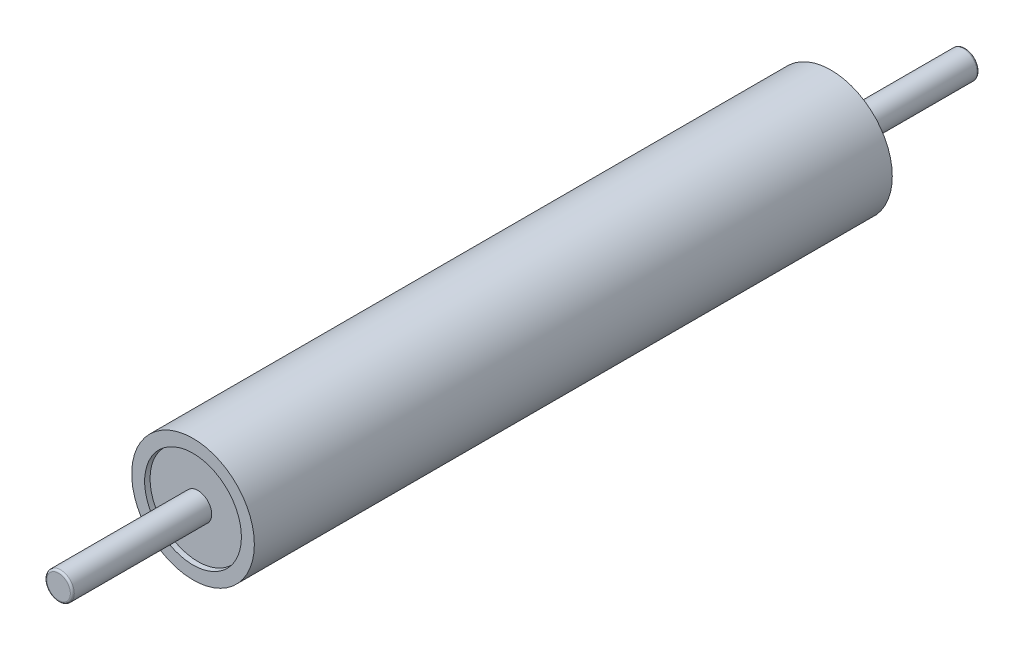
ISO-10303-21;
HEADER;
FILE_DESCRIPTION(('STEP AP214'),'2;1');
FILE_NAME('part.step','',(''),(''),'','','');
FILE_SCHEMA(('AUTOMOTIVE_DESIGN { 1 0 10303 214 1 1 1 1 }'));
ENDSEC;
DATA;
#1=APPLICATION_CONTEXT('core data for automotive mechanical design processes');
#2=APPLICATION_PROTOCOL_DEFINITION('international standard','automotive_design',2000,#1);
#3=PRODUCT_CONTEXT('',#1,'mechanical');
#4=PRODUCT('Part','Part','',(#3));
#5=PRODUCT_RELATED_PRODUCT_CATEGORY('part','',(#4));
#6=PRODUCT_DEFINITION_FORMATION('','',#4);
#7=PRODUCT_DEFINITION_CONTEXT('part definition',#1,'design');
#8=PRODUCT_DEFINITION('design','',#6,#7);
#9=PRODUCT_DEFINITION_SHAPE('','',#8);
#10=(LENGTH_UNIT() NAMED_UNIT(*) SI_UNIT(.MILLI.,.METRE.));
#11=(NAMED_UNIT(*) PLANE_ANGLE_UNIT() SI_UNIT($,.RADIAN.));
#12=(NAMED_UNIT(*) SI_UNIT($,.STERADIAN.) SOLID_ANGLE_UNIT());
#13=UNCERTAINTY_MEASURE_WITH_UNIT(LENGTH_MEASURE(1.E-05),#10,'distance_accuracy_value','');
#14=(GEOMETRIC_REPRESENTATION_CONTEXT(3) GLOBAL_UNCERTAINTY_ASSIGNED_CONTEXT((#13)) GLOBAL_UNIT_ASSIGNED_CONTEXT((#10,
#11,#12)) REPRESENTATION_CONTEXT('',''));
#15=CARTESIAN_POINT('',(0.,0.,0.));
#16=DIRECTION('',(0.,0.,1.));
#17=DIRECTION('',(1.,0.,0.));
#18=AXIS2_PLACEMENT_3D('',#15,#16,#17);
#19=CARTESIAN_POINT('',(169.486096031671,197.021568845784,629.124078995286));
#20=DIRECTION('',(0.,0.,-1.));
#21=DIRECTION('',(-0.982062299122621,0.188556730566668,0.));
#22=AXIS2_PLACEMENT_3D('',#19,#20,#21);
#23=CYLINDRICAL_SURFACE('',#22,48.8);
#24=CARTESIAN_POINT('',(169.486096031671,197.021568845784,629.124078995286));
#25=DIRECTION('',(0.,0.,1.));
#26=DIRECTION('',(0.982062299122621,-0.188556730566668,0.));
#27=AXIS2_PLACEMENT_3D('',#24,#25,#26);
#28=CIRCLE('',#27,48.8);
#29=CARTESIAN_POINT('',(217.410736228855,187.820000394131,629.124078995286));
#30=VERTEX_POINT('',#29);
#31=EDGE_CURVE('P0_E10',#30,#30,#28,.T.);
#32=ORIENTED_EDGE('',*,*,#31,.F.);
#33=EDGE_LOOP('',(#32));
#34=FACE_BOUND('',#33,.T.);
#35=CARTESIAN_POINT('',(169.486096031671,197.021568845784,622.124078995286));
#36=DIRECTION('',(0.,0.,1.));
#37=DIRECTION('',(0.982062299122621,-0.188556730566668,0.));
#38=AXIS2_PLACEMENT_3D('',#35,#36,#37);
#39=CIRCLE('',#38,48.8);
#40=CARTESIAN_POINT('',(217.410736228855,187.820000394131,622.124078995286));
#41=VERTEX_POINT('',#40);
#42=EDGE_CURVE('P0_E18',#41,#41,#39,.T.);
#43=ORIENTED_EDGE('',*,*,#42,.T.);
#44=EDGE_LOOP('',(#43));
#45=FACE_BOUND('',#44,.T.);
#46=ADVANCED_FACE('P0_F15',(#34,#45),#23,.T.);
#47=CARTESIAN_POINT('',(169.486096031671,197.021568845784,629.124078995286));
#48=DIRECTION('',(0.,0.,1.));
#49=DIRECTION('',(0.982062299122621,-0.188556730566668,0.));
#50=AXIS2_PLACEMENT_3D('',#47,#48,#49);
#51=PLANE('',#50);
#52=ORIENTED_EDGE('',*,*,#31,.T.);
#53=EDGE_LOOP('',(#52));
#54=FACE_BOUND('',#53,.T.);
#55=ADVANCED_FACE('P0_F30',(#54),#51,.T.);
#56=CARTESIAN_POINT('',(169.486096031671,197.021568845784,622.124078995286));
#57=DIRECTION('',(0.,0.,1.));
#58=DIRECTION('',(0.982062299122621,-0.188556730566668,0.));
#59=AXIS2_PLACEMENT_3D('',#56,#57,#58);
#60=PLANE('',#59);
#61=ORIENTED_EDGE('',*,*,#42,.F.);
#62=EDGE_LOOP('',(#61));
#63=FACE_BOUND('',#62,.T.);
#64=ADVANCED_FACE('P0_F28',(#63),#60,.F.);
#65=CLOSED_SHELL('',(#46,#55,#64));
#66=MANIFOLD_SOLID_BREP('P0_B1',#65);
#67=CARTESIAN_POINT('',(169.486096031671,197.021568845784,763.775851854555));
#68=DIRECTION('',(0.,0.,1.));
#69=DIRECTION('',(1.,0.,0.));
#70=AXIS2_PLACEMENT_3D('',#67,#68,#69);
#71=CYLINDRICAL_SURFACE('',#70,62.5);
#72=CARTESIAN_POINT('',(169.486096031671,197.021568845784,634.124078995286));
#73=DIRECTION('',(0.,0.,1.));
#74=DIRECTION('',(1.,0.,0.));
#75=AXIS2_PLACEMENT_3D('',#72,#73,#74);
#76=CIRCLE('',#75,62.5);
#77=CARTESIAN_POINT('',(231.986096031671,197.021568845784,634.124078995286));
#78=VERTEX_POINT('',#77);
#79=EDGE_CURVE('P1_E29',#78,#78,#76,.T.);
#80=ORIENTED_EDGE('',*,*,#79,.F.);
#81=EDGE_LOOP('',(#80));
#82=FACE_BOUND('',#81,.T.);
#83=CARTESIAN_POINT('',(169.486096031671,197.021568845784,-15.875921004714));
#84=DIRECTION('',(0.,0.,1.));
#85=DIRECTION('',(1.,0.,0.));
#86=AXIS2_PLACEMENT_3D('',#83,#84,#85);
#87=CIRCLE('',#86,62.5);
#88=CARTESIAN_POINT('',(231.986096031671,197.021568845784,-15.875921004714));
#89=VERTEX_POINT('',#88);
#90=EDGE_CURVE('P1_E10',#89,#89,#87,.T.);
#91=ORIENTED_EDGE('',*,*,#90,.T.);
#92=EDGE_LOOP('',(#91));
#93=FACE_BOUND('',#92,.T.);
#94=ADVANCED_FACE('P1_F15',(#82,#93),#71,.T.);
#95=CARTESIAN_POINT('',(169.486096031671,259.521568845784,-15.875921004714));
#96=DIRECTION('',(0.,0.,1.));
#97=DIRECTION('',(1.,0.,0.));
#98=AXIS2_PLACEMENT_3D('',#95,#96,#97);
#99=PLANE('',#98);
#100=ORIENTED_EDGE('',*,*,#90,.F.);
#101=EDGE_LOOP('',(#100));
#102=FACE_BOUND('',#101,.T.);
#103=CARTESIAN_POINT('',(169.486096031671,197.021568845784,-15.875921004714));
#104=DIRECTION('',(0.,0.,1.));
#105=DIRECTION('',(1.,0.,0.));
#106=AXIS2_PLACEMENT_3D('',#103,#104,#105);
#107=CIRCLE('',#106,49.3000000000001);
#108=CARTESIAN_POINT('',(218.786096031671,197.021568845784,-15.875921004714));
#109=VERTEX_POINT('',#108);
#110=EDGE_CURVE('P1_E21',#109,#109,#107,.T.);
#111=ORIENTED_EDGE('',*,*,#110,.T.);
#112=EDGE_LOOP('',(#111));
#113=FACE_BOUND('',#112,.T.);
#114=ADVANCED_FACE('P1_F38',(#102,#113),#99,.F.);
#115=CARTESIAN_POINT('',(169.486096031671,197.021568845784,763.775851854555));
#116=DIRECTION('',(0.,0.,1.));
#117=DIRECTION('',(1.,0.,0.));
#118=AXIS2_PLACEMENT_3D('',#115,#116,#117);
#119=CYLINDRICAL_SURFACE('',#118,49.3);
#120=ORIENTED_EDGE('',*,*,#110,.F.);
#121=EDGE_LOOP('',(#120));
#122=FACE_BOUND('',#121,.T.);
#123=CARTESIAN_POINT('',(169.486096031671,197.021568845784,634.124078995286));
#124=DIRECTION('',(0.,0.,1.));
#125=DIRECTION('',(1.,0.,0.));
#126=AXIS2_PLACEMENT_3D('',#123,#124,#125);
#127=CIRCLE('',#126,49.3);
#128=CARTESIAN_POINT('',(218.786096031671,197.021568845784,634.124078995286));
#129=VERTEX_POINT('',#128);
#130=EDGE_CURVE('P1_E25',#129,#129,#127,.T.);
#131=ORIENTED_EDGE('',*,*,#130,.T.);
#132=EDGE_LOOP('',(#131));
#133=FACE_BOUND('',#132,.T.);
#134=ADVANCED_FACE('P1_F43',(#122,#133),#119,.F.);
#135=CARTESIAN_POINT('',(169.486096031671,246.321568845784,634.124078995286));
#136=DIRECTION('',(0.,0.,-1.));
#137=DIRECTION('',(-1.,0.,0.));
#138=AXIS2_PLACEMENT_3D('',#135,#136,#137);
#139=PLANE('',#138);
#140=ORIENTED_EDGE('',*,*,#130,.F.);
#141=EDGE_LOOP('',(#140));
#142=FACE_BOUND('',#141,.T.);
#143=ORIENTED_EDGE('',*,*,#79,.T.);
#144=EDGE_LOOP('',(#143));
#145=FACE_BOUND('',#144,.T.);
#146=ADVANCED_FACE('P1_F35',(#142,#145),#139,.F.);
#147=CLOSED_SHELL('',(#94,#114,#134,#146));
#148=MANIFOLD_SOLID_BREP('P1_B1',#147);
#149=CARTESIAN_POINT('',(169.486096031671,197.021568845784,-3.87592100471402));
#150=DIRECTION('',(0.,0.,-1.));
#151=DIRECTION('',(-0.965867779274395,-0.259035582419769,0.));
#152=AXIS2_PLACEMENT_3D('',#149,#150,#151);
#153=CYLINDRICAL_SURFACE('',#152,48.8);
#154=CARTESIAN_POINT('',(169.486096031671,197.021568845784,-3.87592100471402));
#155=DIRECTION('',(0.,0.,1.));
#156=DIRECTION('',(0.965867779274395,0.259035582419769,0.));
#157=AXIS2_PLACEMENT_3D('',#154,#155,#156);
#158=CIRCLE('',#157,48.8);
#159=CARTESIAN_POINT('',(122.351748403081,184.3806324237,-3.87592100471402));
#160=VERTEX_POINT('',#159);
#161=EDGE_CURVE('P2_E10',#160,#160,#158,.T.);
#162=CARTESIAN_POINT('',(169.486096031671,197.021568845784,-10.875921004714));
#163=DIRECTION('',(0.,0.,1.));
#164=DIRECTION('',(0.965867779274395,0.259035582419769,0.));
#165=AXIS2_PLACEMENT_3D('',#162,#163,#164);
#166=CIRCLE('',#165,48.8);
#167=CARTESIAN_POINT('',(122.351748403081,184.3806324237,-10.875921004714));
#168=VERTEX_POINT('',#167);
#169=EDGE_CURVE('P2_E18',#168,#168,#166,.T.);
#170=CARTESIAN_POINT('',(122.351748403081,184.3806324237,-3.87592100471402));
#171=CARTESIAN_POINT('',(122.351748403081,184.3806324237,-3.94883767138069));
#172=CARTESIAN_POINT('',(122.351748403081,184.3806324237,-4.02175433804736));
#173=CARTESIAN_POINT('',(122.351748403081,184.3806324237,-4.16758767138069));
#174=CARTESIAN_POINT('',(122.351748403081,184.3806324237,-4.24050433804736));
#175=CARTESIAN_POINT('',(122.351748403081,184.3806324237,-4.38633767138069));
#176=CARTESIAN_POINT('',(122.351748403081,184.3806324237,-4.45925433804736));
#177=CARTESIAN_POINT('',(122.351748403081,184.3806324237,-4.60508767138069));
#178=CARTESIAN_POINT('',(122.351748403081,184.3806324237,-4.67800433804736));
#179=CARTESIAN_POINT('',(122.351748403081,184.3806324237,-4.82383767138069));
#180=CARTESIAN_POINT('',(122.351748403081,184.3806324237,-4.89675433804736));
#181=CARTESIAN_POINT('',(122.351748403081,184.3806324237,-5.04258767138069));
#182=CARTESIAN_POINT('',(122.351748403081,184.3806324237,-5.11550433804736));
#183=CARTESIAN_POINT('',(122.351748403081,184.3806324237,-5.26133767138069));
#184=CARTESIAN_POINT('',(122.351748403081,184.3806324237,-5.33425433804736));
#185=CARTESIAN_POINT('',(122.351748403081,184.3806324237,-5.48008767138069));
#186=CARTESIAN_POINT('',(122.351748403081,184.3806324237,-5.55300433804736));
#187=CARTESIAN_POINT('',(122.351748403081,184.3806324237,-5.69883767138069));
#188=CARTESIAN_POINT('',(122.351748403081,184.3806324237,-5.77175433804736));
#189=CARTESIAN_POINT('',(122.351748403081,184.3806324237,-5.91758767138069));
#190=CARTESIAN_POINT('',(122.351748403081,184.3806324237,-5.99050433804736));
#191=CARTESIAN_POINT('',(122.351748403081,184.3806324237,-6.13633767138069));
#192=CARTESIAN_POINT('',(122.351748403081,184.3806324237,-6.20925433804736));
#193=CARTESIAN_POINT('',(122.351748403081,184.3806324237,-6.35508767138069));
#194=CARTESIAN_POINT('',(122.351748403081,184.3806324237,-6.42800433804736));
#195=CARTESIAN_POINT('',(122.351748403081,184.3806324237,-6.57383767138069));
#196=CARTESIAN_POINT('',(122.351748403081,184.3806324237,-6.64675433804736));
#197=CARTESIAN_POINT('',(122.351748403081,184.3806324237,-6.79258767138069));
#198=CARTESIAN_POINT('',(122.351748403081,184.3806324237,-6.86550433804736));
#199=CARTESIAN_POINT('',(122.351748403081,184.3806324237,-7.01133767138069));
#200=CARTESIAN_POINT('',(122.351748403081,184.3806324237,-7.08425433804736));
#201=CARTESIAN_POINT('',(122.351748403081,184.3806324237,-7.23008767138069));
#202=CARTESIAN_POINT('',(122.351748403081,184.3806324237,-7.30300433804736));
#203=CARTESIAN_POINT('',(122.351748403081,184.3806324237,-7.44883767138069));
#204=CARTESIAN_POINT('',(122.351748403081,184.3806324237,-7.52175433804736));
#205=CARTESIAN_POINT('',(122.351748403081,184.3806324237,-7.66758767138069));
#206=CARTESIAN_POINT('',(122.351748403081,184.3806324237,-7.74050433804736));
#207=CARTESIAN_POINT('',(122.351748403081,184.3806324237,-7.88633767138069));
#208=CARTESIAN_POINT('',(122.351748403081,184.3806324237,-7.95925433804736));
#209=CARTESIAN_POINT('',(122.351748403081,184.3806324237,-8.10508767138069));
#210=CARTESIAN_POINT('',(122.351748403081,184.3806324237,-8.17800433804736));
#211=CARTESIAN_POINT('',(122.351748403081,184.3806324237,-8.32383767138069));
#212=CARTESIAN_POINT('',(122.351748403081,184.3806324237,-8.39675433804736));
#213=CARTESIAN_POINT('',(122.351748403081,184.3806324237,-8.54258767138069));
#214=CARTESIAN_POINT('',(122.351748403081,184.3806324237,-8.61550433804736));
#215=CARTESIAN_POINT('',(122.351748403081,184.3806324237,-8.76133767138069));
#216=CARTESIAN_POINT('',(122.351748403081,184.3806324237,-8.83425433804736));
#217=CARTESIAN_POINT('',(122.351748403081,184.3806324237,-8.98008767138069));
#218=CARTESIAN_POINT('',(122.351748403081,184.3806324237,-9.05300433804736));
#219=CARTESIAN_POINT('',(122.351748403081,184.3806324237,-9.19883767138069));
#220=CARTESIAN_POINT('',(122.351748403081,184.3806324237,-9.27175433804736));
#221=CARTESIAN_POINT('',(122.351748403081,184.3806324237,-9.41758767138069));
#222=CARTESIAN_POINT('',(122.351748403081,184.3806324237,-9.49050433804736));
#223=CARTESIAN_POINT('',(122.351748403081,184.3806324237,-9.63633767138069));
#224=CARTESIAN_POINT('',(122.351748403081,184.3806324237,-9.70925433804736));
#225=CARTESIAN_POINT('',(122.351748403081,184.3806324237,-9.85508767138069));
#226=CARTESIAN_POINT('',(122.351748403081,184.3806324237,-9.92800433804736));
#227=CARTESIAN_POINT('',(122.351748403081,184.3806324237,-10.0738376713807));
#228=CARTESIAN_POINT('',(122.351748403081,184.3806324237,-10.1467543380474));
#229=CARTESIAN_POINT('',(122.351748403081,184.3806324237,-10.2925876713807));
#230=CARTESIAN_POINT('',(122.351748403081,184.3806324237,-10.3655043380474));
#231=CARTESIAN_POINT('',(122.351748403081,184.3806324237,-10.5113376713807));
#232=CARTESIAN_POINT('',(122.351748403081,184.3806324237,-10.5842543380474));
#233=CARTESIAN_POINT('',(122.351748403081,184.3806324237,-10.7300876713807));
#234=CARTESIAN_POINT('',(122.351748403081,184.3806324237,-10.8030043380474));
#235=CARTESIAN_POINT('',(122.351748403081,184.3806324237,-10.875921004714));
#236=B_SPLINE_CURVE_WITH_KNOTS('',3,(#170,#171,#172,#173,#174,#175,#176,#177,#178,#179,#180,
#181,#182,#183,#184,#185,#186,#187,#188,#189,#190,#191,#192,#193,#194,#195,#196,#197,#198,#199,
#200,#201,#202,#203,#204,#205,#206,#207,#208,#209,#210,#211,#212,#213,#214,#215,#216,#217,#218,
#219,#220,#221,#222,#223,#224,#225,#226,#227,#228,#229,#230,#231,#232,#233,#234,#235),
.UNSPECIFIED.,.F.,.F.,(4,2,2,2,2,2,2,2,2,2,2,2,2,2,2,2,2,2,2,2,2,2,2,2,2,2,2,2,2,2,2,2,4),(0.,
0.21875,0.4375,0.656250000000001,0.875,1.09375,1.3125,1.53125,1.75,1.96875,2.1875,2.40625,2.625,
2.84375,3.0625,3.28125,3.5,3.71875,3.9375,4.15625,4.375,4.59375,4.8125,5.03125,5.25,5.46875,
5.6875,5.90625,6.125,6.34375,6.5625,6.78125,7.),.UNSPECIFIED.);
#237=EDGE_CURVE('P2_BSEAM15',#160,#168,#236,.T.);
#238=ORIENTED_EDGE('',*,*,#161,.F.);
#239=ORIENTED_EDGE('',*,*,#169,.T.);
#240=ORIENTED_EDGE('',*,*,#237,.T.);
#241=ORIENTED_EDGE('',*,*,#237,.F.);
#242=EDGE_LOOP('',(#238,#240,#239,#241));
#243=FACE_BOUND('',#242,.T.);
#244=ADVANCED_FACE('P2_F15',(#243),#153,.T.);
#245=CARTESIAN_POINT('',(169.486096031671,197.021568845784,-3.87592100471402));
#246=DIRECTION('',(0.,0.,1.));
#247=DIRECTION('',(0.965867779274395,0.259035582419769,0.));
#248=AXIS2_PLACEMENT_3D('',#245,#246,#247);
#249=PLANE('',#248);
#250=ORIENTED_EDGE('',*,*,#161,.T.);
#251=EDGE_LOOP('',(#250));
#252=FACE_BOUND('',#251,.T.);
#253=ADVANCED_FACE('P2_F30',(#252),#249,.T.);
#254=CARTESIAN_POINT('',(169.486096031671,197.021568845784,-10.875921004714));
#255=DIRECTION('',(0.,0.,1.));
#256=DIRECTION('',(0.965867779274395,0.259035582419769,0.));
#257=AXIS2_PLACEMENT_3D('',#254,#255,#256);
#258=PLANE('',#257);
#259=ORIENTED_EDGE('',*,*,#169,.F.);
#260=EDGE_LOOP('',(#259));
#261=FACE_BOUND('',#260,.T.);
#262=ADVANCED_FACE('P2_F28',(#261),#258,.F.);
#263=CLOSED_SHELL('',(#244,#253,#262));
#264=MANIFOLD_SOLID_BREP('P2_B1',#263);
#265=CARTESIAN_POINT('',(169.486096031671,197.021568845784,771.124078995286));
#266=DIRECTION('',(0.,0.,-1.));
#267=DIRECTION('',(-0.965789924941356,-0.25932570424424,0.));
#268=AXIS2_PLACEMENT_3D('',#265,#266,#267);
#269=CYLINDRICAL_SURFACE('',#268,14.);
#270=CARTESIAN_POINT('',(169.486096031671,197.021568845784,769.124078995286));
#271=DIRECTION('',(0.,0.,1.));
#272=DIRECTION('',(0.965789924941356,0.25932570424424,0.));
#273=AXIS2_PLACEMENT_3D('',#270,#271,#272);
#274=CIRCLE('',#273,14.);
#275=CARTESIAN_POINT('',(183.00715498085,200.652128705204,769.124078995286));
#276=VERTEX_POINT('',#275);
#277=EDGE_CURVE('P3_E9',#276,#276,#274,.F.);
#278=ORIENTED_EDGE('',*,*,#277,.T.);
#279=EDGE_LOOP('',(#278));
#280=FACE_BOUND('',#279,.T.);
#281=CARTESIAN_POINT('',(169.486096031671,197.021568845784,629.124078995286));
#282=DIRECTION('',(0.,0.,1.));
#283=DIRECTION('',(0.965789924941356,0.25932570424424,0.));
#284=AXIS2_PLACEMENT_3D('',#281,#282,#283);
#285=CIRCLE('',#284,14.);
#286=CARTESIAN_POINT('',(183.00715498085,200.652128705204,629.124078995286));
#287=VERTEX_POINT('',#286);
#288=EDGE_CURVE('P3_E25',#287,#287,#285,.T.);
#289=ORIENTED_EDGE('',*,*,#288,.T.);
#290=EDGE_LOOP('',(#289));
#291=FACE_BOUND('',#290,.T.);
#292=ADVANCED_FACE('P3_F14',(#280,#291),#269,.T.);
#293=CARTESIAN_POINT('',(169.486096031671,197.021568845784,771.124078995286));
#294=DIRECTION('',(0.,0.,1.));
#295=DIRECTION('',(0.965789924941356,0.25932570424424,0.));
#296=AXIS2_PLACEMENT_3D('',#293,#294,#295);
#297=PLANE('',#296);
#298=CARTESIAN_POINT('',(169.486096031671,197.021568845784,771.124078995286));
#299=DIRECTION('',(0.,0.,1.));
#300=DIRECTION('',(0.965789924941356,0.25932570424424,0.));
#301=AXIS2_PLACEMENT_3D('',#298,#299,#300);
#302=CIRCLE('',#301,12.);
#303=CARTESIAN_POINT('',(181.075575130968,200.133477296715,771.124078995286));
#304=VERTEX_POINT('',#303);
#305=EDGE_CURVE('P3_E21',#304,#304,#302,.T.);
#306=ORIENTED_EDGE('',*,*,#305,.T.);
#307=EDGE_LOOP('',(#306));
#308=FACE_BOUND('',#307,.T.);
#309=ADVANCED_FACE('P3_F35',(#308),#297,.T.);
#310=CARTESIAN_POINT('',(169.486096031671,197.021568845784,629.124078995286));
#311=DIRECTION('',(0.,0.,1.));
#312=DIRECTION('',(0.965789924941356,0.25932570424424,0.));
#313=AXIS2_PLACEMENT_3D('',#310,#311,#312);
#314=PLANE('',#313);
#315=ORIENTED_EDGE('',*,*,#288,.F.);
#316=EDGE_LOOP('',(#315));
#317=FACE_BOUND('',#316,.T.);
#318=ADVANCED_FACE('P3_F33',(#317),#314,.F.);
#319=CARTESIAN_POINT('',(169.486096031671,197.021568845784,769.124078995286));
#320=DIRECTION('',(0.,0.,1.));
#321=DIRECTION('',(0.965789924941356,0.25932570424424,0.));
#322=AXIS2_PLACEMENT_3D('',#319,#320,#321);
#323=TOROIDAL_SURFACE('',#322,12.,2.);
#324=ORIENTED_EDGE('',*,*,#277,.F.);
#325=EDGE_LOOP('',(#324));
#326=FACE_BOUND('',#325,.T.);
#327=ORIENTED_EDGE('',*,*,#305,.F.);
#328=EDGE_LOOP('',(#327));
#329=FACE_BOUND('',#328,.T.);
#330=ADVANCED_FACE('P3_F16',(#326,#329),#323,.T.);
#331=CLOSED_SHELL('',(#292,#309,#318,#330));
#332=MANIFOLD_SOLID_BREP('P3_B1',#331);
#333=CARTESIAN_POINT('',(169.486096031671,197.021568845784,-152.875921004714));
#334=DIRECTION('',(0.,0.,1.));
#335=DIRECTION('',(0.940156810208273,0.340742090471673,0.));
#336=AXIS2_PLACEMENT_3D('',#333,#334,#335);
#337=CYLINDRICAL_SURFACE('',#336,14.);
#338=CARTESIAN_POINT('',(169.486096031671,197.021568845784,-150.875921004714));
#339=DIRECTION('',(0.,0.,-1.));
#340=DIRECTION('',(-0.940156810208273,-0.340742090471673,0.));
#341=AXIS2_PLACEMENT_3D('',#338,#339,#340);
#342=CIRCLE('',#341,14.);
#343=CARTESIAN_POINT('',(182.648291374587,201.791958112388,-150.875921004714));
#344=VERTEX_POINT('',#343);
#345=EDGE_CURVE('P4_E10',#344,#344,#342,.F.);
#346=CARTESIAN_POINT('',(169.486096031671,197.021568845784,-10.8759210047141));
#347=DIRECTION('',(0.,0.,-1.));
#348=DIRECTION('',(-0.940156810208273,-0.340742090471673,0.));
#349=AXIS2_PLACEMENT_3D('',#346,#347,#348);
#350=CIRCLE('',#349,14.);
#351=CARTESIAN_POINT('',(182.648291374587,201.791958112388,-10.875921004714));
#352=VERTEX_POINT('',#351);
#353=EDGE_CURVE('P4_E26',#352,#352,#350,.T.);
#354=CARTESIAN_POINT('',(182.648291374587,201.791958112388,-150.875921004714));
#355=CARTESIAN_POINT('',(182.648291374587,201.791958112388,-149.417587671381));
#356=CARTESIAN_POINT('',(182.648291374587,201.791958112388,-147.959254338047));
#357=CARTESIAN_POINT('',(182.648291374587,201.791958112388,-145.042587671381));
#358=CARTESIAN_POINT('',(182.648291374587,201.791958112388,-143.584254338047));
#359=CARTESIAN_POINT('',(182.648291374587,201.791958112388,-140.667587671381));
#360=CARTESIAN_POINT('',(182.648291374587,201.791958112388,-139.209254338047));
#361=CARTESIAN_POINT('',(182.648291374587,201.791958112388,-136.292587671381));
#362=CARTESIAN_POINT('',(182.648291374587,201.791958112388,-134.834254338047));
#363=CARTESIAN_POINT('',(182.648291374587,201.791958112388,-131.917587671381));
#364=CARTESIAN_POINT('',(182.648291374587,201.791958112388,-130.459254338047));
#365=CARTESIAN_POINT('',(182.648291374587,201.791958112388,-127.542587671381));
#366=CARTESIAN_POINT('',(182.648291374587,201.791958112388,-126.084254338047));
#367=CARTESIAN_POINT('',(182.648291374587,201.791958112388,-123.167587671381));
#368=CARTESIAN_POINT('',(182.648291374587,201.791958112388,-121.709254338047));
#369=CARTESIAN_POINT('',(182.648291374587,201.791958112388,-118.792587671381));
#370=CARTESIAN_POINT('',(182.648291374587,201.791958112388,-117.334254338047));
#371=CARTESIAN_POINT('',(182.648291374587,201.791958112388,-114.417587671381));
#372=CARTESIAN_POINT('',(182.648291374587,201.791958112388,-112.959254338047));
#373=CARTESIAN_POINT('',(182.648291374587,201.791958112388,-110.042587671381));
#374=CARTESIAN_POINT('',(182.648291374587,201.791958112388,-108.584254338047));
#375=CARTESIAN_POINT('',(182.648291374587,201.791958112388,-105.667587671381));
#376=CARTESIAN_POINT('',(182.648291374587,201.791958112388,-104.209254338047));
#377=CARTESIAN_POINT('',(182.648291374587,201.791958112388,-101.292587671381));
#378=CARTESIAN_POINT('',(182.648291374587,201.791958112388,-99.8342543380474));
#379=CARTESIAN_POINT('',(182.648291374587,201.791958112388,-96.9175876713807));
#380=CARTESIAN_POINT('',(182.648291374587,201.791958112388,-95.4592543380474));
#381=CARTESIAN_POINT('',(182.648291374587,201.791958112388,-92.5425876713807));
#382=CARTESIAN_POINT('',(182.648291374587,201.791958112388,-91.0842543380474));
#383=CARTESIAN_POINT('',(182.648291374587,201.791958112388,-88.1675876713807));
#384=CARTESIAN_POINT('',(182.648291374587,201.791958112388,-86.7092543380474));
#385=CARTESIAN_POINT('',(182.648291374587,201.791958112388,-83.7925876713807));
#386=CARTESIAN_POINT('',(182.648291374587,201.791958112388,-82.3342543380474));
#387=CARTESIAN_POINT('',(182.648291374587,201.791958112388,-79.4175876713807));
#388=CARTESIAN_POINT('',(182.648291374587,201.791958112388,-77.9592543380474));
#389=CARTESIAN_POINT('',(182.648291374587,201.791958112388,-75.0425876713807));
#390=CARTESIAN_POINT('',(182.648291374587,201.791958112388,-73.5842543380474));
#391=CARTESIAN_POINT('',(182.648291374587,201.791958112388,-70.6675876713807));
#392=CARTESIAN_POINT('',(182.648291374587,201.791958112388,-69.2092543380474));
#393=CARTESIAN_POINT('',(182.648291374587,201.791958112388,-66.2925876713807));
#394=CARTESIAN_POINT('',(182.648291374587,201.791958112388,-64.8342543380474));
#395=CARTESIAN_POINT('',(182.648291374587,201.791958112388,-61.9175876713807));
#396=CARTESIAN_POINT('',(182.648291374587,201.791958112388,-60.4592543380474));
#397=CARTESIAN_POINT('',(182.648291374587,201.791958112388,-57.5425876713807));
#398=CARTESIAN_POINT('',(182.648291374587,201.791958112388,-56.0842543380474));
#399=CARTESIAN_POINT('',(182.648291374587,201.791958112388,-53.1675876713807));
#400=CARTESIAN_POINT('',(182.648291374587,201.791958112388,-51.7092543380474));
#401=CARTESIAN_POINT('',(182.648291374587,201.791958112388,-48.7925876713807));
#402=CARTESIAN_POINT('',(182.648291374587,201.791958112388,-47.3342543380474));
#403=CARTESIAN_POINT('',(182.648291374587,201.791958112388,-44.4175876713807));
#404=CARTESIAN_POINT('',(182.648291374587,201.791958112388,-42.9592543380474));
#405=CARTESIAN_POINT('',(182.648291374587,201.791958112388,-40.0425876713807));
#406=CARTESIAN_POINT('',(182.648291374587,201.791958112388,-38.5842543380474));
#407=CARTESIAN_POINT('',(182.648291374587,201.791958112388,-35.6675876713807));
#408=CARTESIAN_POINT('',(182.648291374587,201.791958112388,-34.2092543380474));
#409=CARTESIAN_POINT('',(182.648291374587,201.791958112388,-31.2925876713807));
#410=CARTESIAN_POINT('',(182.648291374587,201.791958112388,-29.8342543380474));
#411=CARTESIAN_POINT('',(182.648291374587,201.791958112388,-26.9175876713807));
#412=CARTESIAN_POINT('',(182.648291374587,201.791958112388,-25.4592543380474));
#413=CARTESIAN_POINT('',(182.648291374587,201.791958112388,-22.5425876713807));
#414=CARTESIAN_POINT('',(182.648291374587,201.791958112388,-21.0842543380474));
#415=CARTESIAN_POINT('',(182.648291374587,201.791958112388,-18.1675876713807));
#416=CARTESIAN_POINT('',(182.648291374587,201.791958112388,-16.7092543380474));
#417=CARTESIAN_POINT('',(182.648291374587,201.791958112388,-13.7925876713807));
#418=CARTESIAN_POINT('',(182.648291374587,201.791958112388,-12.3342543380474));
#419=CARTESIAN_POINT('',(182.648291374587,201.791958112388,-10.875921004714));
#420=B_SPLINE_CURVE_WITH_KNOTS('',3,(#354,#355,#356,#357,#358,#359,#360,#361,#362,#363,#364,
#365,#366,#367,#368,#369,#370,#371,#372,#373,#374,#375,#376,#377,#378,#379,#380,#381,#382,#383,
#384,#385,#386,#387,#388,#389,#390,#391,#392,#393,#394,#395,#396,#397,#398,#399,#400,#401,#402,
#403,#404,#405,#406,#407,#408,#409,#410,#411,#412,#413,#414,#415,#416,#417,#418,#419),
.UNSPECIFIED.,.F.,.F.,(4,2,2,2,2,2,2,2,2,2,2,2,2,2,2,2,2,2,2,2,2,2,2,2,2,2,2,2,2,2,2,2,4),(0.,
4.37499999999999,8.74999999999998,13.125,17.5,21.875,26.25,30.625,35.,39.375,43.75,48.125,52.5,
56.875,61.25,65.625,70.,74.375,78.75,83.125,87.5,91.875,96.25,100.625,105.,109.375,113.75,
118.125,122.5,126.875,131.25,135.625,140.),.UNSPECIFIED.);
#421=EDGE_CURVE('P4_BSEAM15',#344,#352,#420,.T.);
#422=ORIENTED_EDGE('',*,*,#345,.T.);
#423=ORIENTED_EDGE('',*,*,#353,.T.);
#424=ORIENTED_EDGE('',*,*,#421,.T.);
#425=ORIENTED_EDGE('',*,*,#421,.F.);
#426=EDGE_LOOP('',(#422,#424,#423,#425));
#427=FACE_BOUND('',#426,.T.);
#428=ADVANCED_FACE('P4_F15',(#427),#337,.T.);
#429=CARTESIAN_POINT('',(169.486096031671,197.021568845784,-152.875921004714));
#430=DIRECTION('',(0.,0.,-1.));
#431=DIRECTION('',(-0.940156810208273,-0.340742090471673,0.));
#432=AXIS2_PLACEMENT_3D('',#429,#430,#431);
#433=PLANE('',#432);
#434=CARTESIAN_POINT('',(169.486096031671,197.021568845784,-152.875921004714));
#435=DIRECTION('',(0.,0.,-1.));
#436=DIRECTION('',(-0.940156810208273,-0.340742090471673,0.));
#437=AXIS2_PLACEMENT_3D('',#434,#435,#436);
#438=CIRCLE('',#437,12.);
#439=CARTESIAN_POINT('',(158.204214309172,192.932663760124,-152.875921004714));
#440=VERTEX_POINT('',#439);
#441=EDGE_CURVE('P4_E22',#440,#440,#438,.T.);
#442=ORIENTED_EDGE('',*,*,#441,.T.);
#443=EDGE_LOOP('',(#442));
#444=FACE_BOUND('',#443,.T.);
#445=ADVANCED_FACE('P4_F36',(#444),#433,.T.);
#446=CARTESIAN_POINT('',(169.486096031671,197.021568845784,-10.8759210047141));
#447=DIRECTION('',(0.,0.,-1.));
#448=DIRECTION('',(-0.940156810208273,-0.340742090471673,0.));
#449=AXIS2_PLACEMENT_3D('',#446,#447,#448);
#450=PLANE('',#449);
#451=ORIENTED_EDGE('',*,*,#353,.F.);
#452=EDGE_LOOP('',(#451));
#453=FACE_BOUND('',#452,.T.);
#454=ADVANCED_FACE('P4_F34',(#453),#450,.F.);
#455=CARTESIAN_POINT('',(169.486096031671,197.021568845784,-150.875921004714));
#456=DIRECTION('',(0.,0.,-1.));
#457=DIRECTION('',(-0.940156810208273,-0.340742090471673,0.));
#458=AXIS2_PLACEMENT_3D('',#455,#456,#457);
#459=TOROIDAL_SURFACE('',#458,12.,2.);
#460=ORIENTED_EDGE('',*,*,#345,.F.);
#461=EDGE_LOOP('',(#460));
#462=FACE_BOUND('',#461,.T.);
#463=ORIENTED_EDGE('',*,*,#441,.F.);
#464=EDGE_LOOP('',(#463));
#465=FACE_BOUND('',#464,.T.);
#466=ADVANCED_FACE('P4_F17',(#462,#465),#459,.T.);
#467=CLOSED_SHELL('',(#428,#445,#454,#466));
#468=MANIFOLD_SOLID_BREP('P4_B1',#467);
#469=ADVANCED_BREP_SHAPE_REPRESENTATION('',(#18,#66,#148,#264,#332,#468),#14);
#470=SHAPE_DEFINITION_REPRESENTATION(#9,#469);
ENDSEC;
END-ISO-10303-21;
